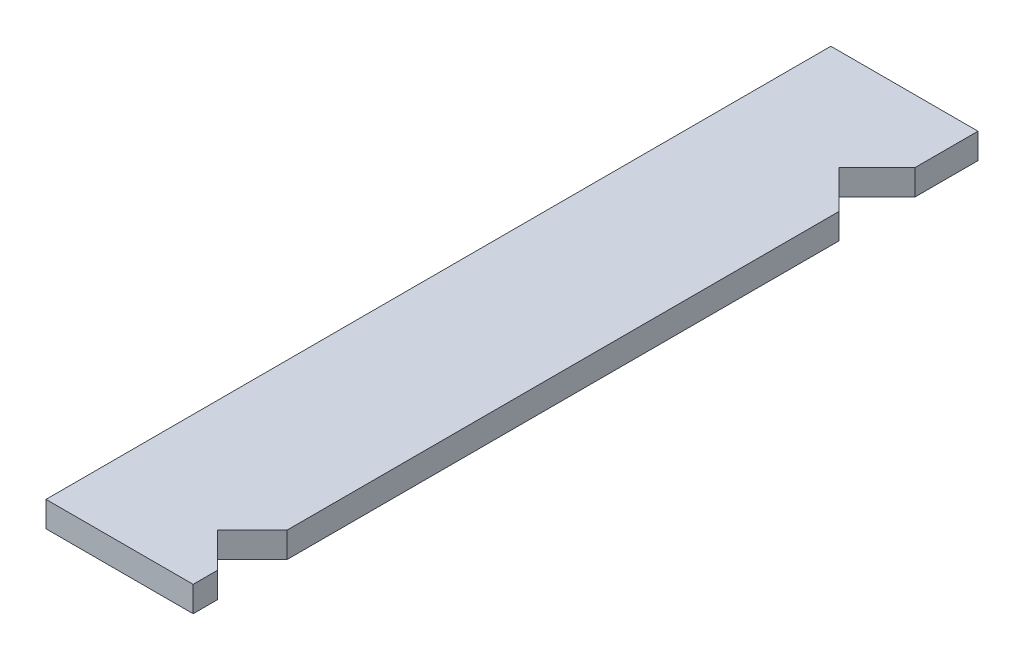
ISO-10303-21;
HEADER;
FILE_DESCRIPTION(('STEP AP214'),'2;1');
FILE_NAME('part.step','',(''),(''),'','','');
FILE_SCHEMA(('AUTOMOTIVE_DESIGN { 1 0 10303 214 1 1 1 1 }'));
ENDSEC;
DATA;
#1=APPLICATION_CONTEXT('core data for automotive mechanical design processes');
#2=APPLICATION_PROTOCOL_DEFINITION('international standard','automotive_design',2000,#1);
#3=PRODUCT_CONTEXT('',#1,'mechanical');
#4=PRODUCT('Part','Part','',(#3));
#5=PRODUCT_RELATED_PRODUCT_CATEGORY('part','',(#4));
#6=PRODUCT_DEFINITION_FORMATION('','',#4);
#7=PRODUCT_DEFINITION_CONTEXT('part definition',#1,'design');
#8=PRODUCT_DEFINITION('design','',#6,#7);
#9=PRODUCT_DEFINITION_SHAPE('','',#8);
#10=(LENGTH_UNIT() NAMED_UNIT(*) SI_UNIT(.MILLI.,.METRE.));
#11=(NAMED_UNIT(*) PLANE_ANGLE_UNIT() SI_UNIT($,.RADIAN.));
#12=(NAMED_UNIT(*) SI_UNIT($,.STERADIAN.) SOLID_ANGLE_UNIT());
#13=UNCERTAINTY_MEASURE_WITH_UNIT(LENGTH_MEASURE(1.E-05),#10,'distance_accuracy_value','');
#14=(GEOMETRIC_REPRESENTATION_CONTEXT(3) GLOBAL_UNCERTAINTY_ASSIGNED_CONTEXT((#13)) GLOBAL_UNIT_ASSIGNED_CONTEXT((#10,
#11,#12)) REPRESENTATION_CONTEXT('',''));
#15=CARTESIAN_POINT('',(0.,0.,0.));
#16=DIRECTION('',(0.,0.,1.));
#17=DIRECTION('',(1.,0.,0.));
#18=AXIS2_PLACEMENT_3D('',#15,#16,#17);
#19=CARTESIAN_POINT('',(30.,5.2,0.));
#20=DIRECTION('',(-1.,0.,0.));
#21=DIRECTION('',(0.,0.,1.));
#22=AXIS2_PLACEMENT_3D('',#19,#20,#21);
#23=PLANE('',#22);
#24=DIRECTION('',(0.,0.,-1.));
#25=VECTOR('',#24,1.);
#26=CARTESIAN_POINT('',(30.,0.,0.));
#27=LINE('',#26,#25);
#28=CARTESIAN_POINT('',(30.,0.,0.));
#29=VERTEX_POINT('',#28);
#30=CARTESIAN_POINT('',(30.,0.,-5.));
#31=VERTEX_POINT('',#30);
#32=EDGE_CURVE('E146',#29,#31,#27,.T.);
#33=ORIENTED_EDGE('',*,*,#32,.T.);
#34=DIRECTION('',(0.,1.,0.));
#35=VECTOR('',#34,1.);
#36=CARTESIAN_POINT('',(30.,-4.8,-5.));
#37=LINE('',#36,#35);
#38=CARTESIAN_POINT('',(30.,5.2,-5.));
#39=VERTEX_POINT('',#38);
#40=EDGE_CURVE('E143',#31,#39,#37,.T.);
#41=ORIENTED_EDGE('',*,*,#40,.T.);
#42=DIRECTION('',(0.,0.,-1.));
#43=VECTOR('',#42,1.);
#44=CARTESIAN_POINT('',(30.,5.2,0.));
#45=LINE('',#44,#43);
#46=CARTESIAN_POINT('',(30.,5.2,0.));
#47=VERTEX_POINT('',#46);
#48=EDGE_CURVE('E129',#47,#39,#45,.T.);
#49=ORIENTED_EDGE('',*,*,#48,.F.);
#50=DIRECTION('',(0.,-1.,0.));
#51=VECTOR('',#50,1.);
#52=CARTESIAN_POINT('',(30.,5.2,0.));
#53=LINE('',#52,#51);
#54=EDGE_CURVE('E158',#47,#29,#53,.T.);
#55=ORIENTED_EDGE('',*,*,#54,.T.);
#56=EDGE_LOOP('',(#33,#41,#49,#55));
#57=FACE_BOUND('',#56,.T.);
#58=ADVANCED_FACE('F33',(#57),#23,.F.);
#59=CARTESIAN_POINT('',(30.,5.2,-19.1421356237311));
#60=VERTEX_POINT('',#59);
#61=CARTESIAN_POINT('',(30.,5.2,-131.642135623731));
#62=VERTEX_POINT('',#61);
#63=EDGE_CURVE('E124',#60,#62,#45,.T.);
#64=ORIENTED_EDGE('',*,*,#63,.F.);
#65=DIRECTION('',(0.,1.,0.));
#66=VECTOR('',#65,1.);
#67=CARTESIAN_POINT('',(30.,-4.8,-19.1421356237311));
#68=LINE('',#67,#66);
#69=CARTESIAN_POINT('',(30.,0.,-19.1421356237311));
#70=VERTEX_POINT('',#69);
#71=EDGE_CURVE('E107',#70,#60,#68,.T.);
#72=ORIENTED_EDGE('',*,*,#71,.F.);
#73=CARTESIAN_POINT('',(30.,0.,-131.642135623731));
#74=VERTEX_POINT('',#73);
#75=EDGE_CURVE('E150',#70,#74,#27,.T.);
#76=ORIENTED_EDGE('',*,*,#75,.T.);
#77=DIRECTION('',(0.,1.,0.));
#78=VECTOR('',#77,1.);
#79=CARTESIAN_POINT('',(30.,-4.8,-131.642135623731));
#80=LINE('',#79,#78);
#81=EDGE_CURVE('E125',#74,#62,#80,.T.);
#82=ORIENTED_EDGE('',*,*,#81,.T.);
#83=EDGE_LOOP('',(#64,#72,#76,#82));
#84=FACE_BOUND('',#83,.T.);
#85=ADVANCED_FACE('F128',(#84),#23,.F.);
#86=CARTESIAN_POINT('',(0.,5.2,0.));
#87=DIRECTION('',(1.,0.,0.));
#88=DIRECTION('',(0.,0.,-1.));
#89=AXIS2_PLACEMENT_3D('',#86,#87,#88);
#90=PLANE('',#89);
#91=DIRECTION('',(0.,0.,1.));
#92=VECTOR('',#91,1.);
#93=CARTESIAN_POINT('',(0.,0.,0.));
#94=LINE('',#93,#92);
#95=CARTESIAN_POINT('',(0.,0.,-160.));
#96=VERTEX_POINT('',#95);
#97=CARTESIAN_POINT('',(0.,0.,0.));
#98=VERTEX_POINT('',#97);
#99=EDGE_CURVE('E139',#96,#98,#94,.T.);
#100=ORIENTED_EDGE('',*,*,#99,.T.);
#101=DIRECTION('',(0.,-1.,0.));
#102=VECTOR('',#101,1.);
#103=CARTESIAN_POINT('',(0.,5.2,0.));
#104=LINE('',#103,#102);
#105=CARTESIAN_POINT('',(0.,5.2,0.));
#106=VERTEX_POINT('',#105);
#107=EDGE_CURVE('E161',#106,#98,#104,.T.);
#108=ORIENTED_EDGE('',*,*,#107,.F.);
#109=DIRECTION('',(0.,0.,1.));
#110=VECTOR('',#109,1.);
#111=CARTESIAN_POINT('',(0.,5.2,0.));
#112=LINE('',#111,#110);
#113=CARTESIAN_POINT('',(0.,5.2,-160.));
#114=VERTEX_POINT('',#113);
#115=EDGE_CURVE('E152',#114,#106,#112,.T.);
#116=ORIENTED_EDGE('',*,*,#115,.F.);
#117=DIRECTION('',(0.,-1.,0.));
#118=VECTOR('',#117,1.);
#119=CARTESIAN_POINT('',(0.,5.2,-160.));
#120=LINE('',#119,#118);
#121=EDGE_CURVE('E138',#114,#96,#120,.T.);
#122=ORIENTED_EDGE('',*,*,#121,.T.);
#123=EDGE_LOOP('',(#100,#108,#116,#122));
#124=FACE_BOUND('',#123,.T.);
#125=ADVANCED_FACE('F35',(#124),#90,.F.);
#126=CARTESIAN_POINT('',(0.,5.2,0.));
#127=DIRECTION('',(0.,0.,-1.));
#128=DIRECTION('',(-1.,0.,0.));
#129=AXIS2_PLACEMENT_3D('',#126,#127,#128);
#130=PLANE('',#129);
#131=DIRECTION('',(1.,0.,0.));
#132=VECTOR('',#131,1.);
#133=CARTESIAN_POINT('',(0.,0.,0.));
#134=LINE('',#133,#132);
#135=EDGE_CURVE('E142',#98,#29,#134,.T.);
#136=ORIENTED_EDGE('',*,*,#135,.T.);
#137=ORIENTED_EDGE('',*,*,#54,.F.);
#138=DIRECTION('',(1.,0.,0.));
#139=VECTOR('',#138,1.);
#140=CARTESIAN_POINT('',(0.,5.2,0.));
#141=LINE('',#140,#139);
#142=EDGE_CURVE('E133',#106,#47,#141,.T.);
#143=ORIENTED_EDGE('',*,*,#142,.F.);
#144=ORIENTED_EDGE('',*,*,#107,.T.);
#145=EDGE_LOOP('',(#136,#137,#143,#144));
#146=FACE_BOUND('',#145,.T.);
#147=ADVANCED_FACE('F196',(#146),#130,.F.);
#148=CARTESIAN_POINT('',(30.,5.2,-147.198484809835));
#149=VERTEX_POINT('',#148);
#150=CARTESIAN_POINT('',(30.,5.2,-160.));
#151=VERTEX_POINT('',#150);
#152=EDGE_CURVE('E130',#149,#151,#45,.T.);
#153=ORIENTED_EDGE('',*,*,#152,.F.);
#154=DIRECTION('',(0.,1.,0.));
#155=VECTOR('',#154,1.);
#156=CARTESIAN_POINT('',(30.,-4.8,-147.198484809835));
#157=LINE('',#156,#155);
#158=CARTESIAN_POINT('',(30.,0.,-147.198484809835));
#159=VERTEX_POINT('',#158);
#160=EDGE_CURVE('E178',#159,#149,#157,.T.);
#161=ORIENTED_EDGE('',*,*,#160,.F.);
#162=CARTESIAN_POINT('',(30.,0.,-160.));
#163=VERTEX_POINT('',#162);
#164=EDGE_CURVE('E145',#159,#163,#27,.T.);
#165=ORIENTED_EDGE('',*,*,#164,.T.);
#166=DIRECTION('',(0.,-1.,0.));
#167=VECTOR('',#166,1.);
#168=CARTESIAN_POINT('',(30.,5.2,-160.));
#169=LINE('',#168,#167);
#170=EDGE_CURVE('E155',#151,#163,#169,.T.);
#171=ORIENTED_EDGE('',*,*,#170,.F.);
#172=EDGE_LOOP('',(#153,#161,#165,#171));
#173=FACE_BOUND('',#172,.T.);
#174=ADVANCED_FACE('F182',(#173),#23,.F.);
#175=CARTESIAN_POINT('',(0.,5.2,-160.));
#176=DIRECTION('',(0.,0.,1.));
#177=DIRECTION('',(1.,0.,0.));
#178=AXIS2_PLACEMENT_3D('',#175,#176,#177);
#179=PLANE('',#178);
#180=DIRECTION('',(-1.,0.,0.));
#181=VECTOR('',#180,1.);
#182=CARTESIAN_POINT('',(0.,0.,-160.));
#183=LINE('',#182,#181);
#184=EDGE_CURVE('E149',#163,#96,#183,.T.);
#185=ORIENTED_EDGE('',*,*,#184,.T.);
#186=ORIENTED_EDGE('',*,*,#121,.F.);
#187=DIRECTION('',(-1.,0.,0.));
#188=VECTOR('',#187,1.);
#189=CARTESIAN_POINT('',(0.,5.2,-160.));
#190=LINE('',#189,#188);
#191=EDGE_CURVE('E132',#151,#114,#190,.T.);
#192=ORIENTED_EDGE('',*,*,#191,.F.);
#193=ORIENTED_EDGE('',*,*,#170,.T.);
#194=EDGE_LOOP('',(#185,#186,#192,#193));
#195=FACE_BOUND('',#194,.T.);
#196=ADVANCED_FACE('F208',(#195),#179,.F.);
#197=CARTESIAN_POINT('',(0.,5.2,0.));
#198=DIRECTION('',(0.,-1.,0.));
#199=DIRECTION('',(0.,0.,-1.));
#200=AXIS2_PLACEMENT_3D('',#197,#198,#199);
#201=PLANE('',#200);
#202=ORIENTED_EDGE('',*,*,#48,.T.);
#203=DIRECTION('',(0.707106781186554,0.,0.707106781186541));
#204=VECTOR('',#203,1.);
#205=CARTESIAN_POINT('',(22.9289321881345,5.2,-12.0710678118654));
#206=LINE('',#205,#204);
#207=CARTESIAN_POINT('',(22.9289321881345,5.2,-12.0710678118654));
#208=VERTEX_POINT('',#207);
#209=EDGE_CURVE('E117',#208,#39,#206,.T.);
#210=ORIENTED_EDGE('',*,*,#209,.F.);
#211=DIRECTION('',(-0.707106781186541,0.,0.707106781186554));
#212=VECTOR('',#211,1.);
#213=CARTESIAN_POINT('',(30.,5.2,-19.1421356237311));
#214=LINE('',#213,#212);
#215=EDGE_CURVE('E110',#60,#208,#214,.T.);
#216=ORIENTED_EDGE('',*,*,#215,.F.);
#217=ORIENTED_EDGE('',*,*,#63,.T.);
#218=DIRECTION('',(0.707106781186552,0.,0.707106781186543));
#219=VECTOR('',#218,1.);
#220=CARTESIAN_POINT('',(30.,5.2,-131.642135623731));
#221=LINE('',#220,#219);
#222=CARTESIAN_POINT('',(22.2218254069479,5.2,-139.420310216783));
#223=VERTEX_POINT('',#222);
#224=EDGE_CURVE('E184',#223,#62,#221,.T.);
#225=ORIENTED_EDGE('',*,*,#224,.F.);
#226=DIRECTION('',(-0.707106781186543,0.,0.707106781186552));
#227=VECTOR('',#226,1.);
#228=CARTESIAN_POINT('',(22.2218254069479,5.2,-139.420310216783));
#229=LINE('',#228,#227);
#230=EDGE_CURVE('E187',#149,#223,#229,.T.);
#231=ORIENTED_EDGE('',*,*,#230,.F.);
#232=ORIENTED_EDGE('',*,*,#152,.T.);
#233=ORIENTED_EDGE('',*,*,#191,.T.);
#234=ORIENTED_EDGE('',*,*,#115,.T.);
#235=ORIENTED_EDGE('',*,*,#142,.T.);
#236=EDGE_LOOP('',(#202,#210,#216,#217,#225,#231,#232,#233,#234,#235));
#237=FACE_BOUND('',#236,.T.);
#238=ADVANCED_FACE('F122',(#237),#201,.F.);
#239=CARTESIAN_POINT('',(0.,0.,0.));
#240=DIRECTION('',(0.,-1.,0.));
#241=DIRECTION('',(0.,0.,-1.));
#242=AXIS2_PLACEMENT_3D('',#239,#240,#241);
#243=PLANE('',#242);
#244=DIRECTION('',(-0.707106781186554,0.,-0.707106781186541));
#245=VECTOR('',#244,1.);
#246=CARTESIAN_POINT('',(17.4999999999997,0.,-17.5));
#247=LINE('',#246,#245);
#248=CARTESIAN_POINT('',(22.9289321881345,0.,-12.0710678118654));
#249=VERTEX_POINT('',#248);
#250=EDGE_CURVE('E11',#31,#249,#247,.T.);
#251=ORIENTED_EDGE('',*,*,#250,.F.);
#252=ORIENTED_EDGE('',*,*,#32,.F.);
#253=ORIENTED_EDGE('',*,*,#135,.F.);
#254=ORIENTED_EDGE('',*,*,#99,.F.);
#255=ORIENTED_EDGE('',*,*,#184,.F.);
#256=ORIENTED_EDGE('',*,*,#164,.F.);
#257=DIRECTION('',(0.707106781186543,0.,-0.707106781186552));
#258=VECTOR('',#257,1.);
#259=CARTESIAN_POINT('',(-58.5992424049174,0.,-58.5992424049168));
#260=LINE('',#259,#258);
#261=CARTESIAN_POINT('',(22.2218254069479,0.,-139.420310216783));
#262=VERTEX_POINT('',#261);
#263=EDGE_CURVE('E164',#262,#159,#260,.T.);
#264=ORIENTED_EDGE('',*,*,#263,.F.);
#265=DIRECTION('',(-0.707106781186552,0.,-0.707106781186543));
#266=VECTOR('',#265,1.);
#267=CARTESIAN_POINT('',(80.8210678118653,0.,-80.8210678118664));
#268=LINE('',#267,#266);
#269=EDGE_CURVE('E166',#74,#262,#268,.T.);
#270=ORIENTED_EDGE('',*,*,#269,.F.);
#271=ORIENTED_EDGE('',*,*,#75,.F.);
#272=DIRECTION('',(0.707106781186541,0.,-0.707106781186554));
#273=VECTOR('',#272,1.);
#274=CARTESIAN_POINT('',(5.42893218813473,0.,5.42893218813464));
#275=LINE('',#274,#273);
#276=EDGE_CURVE('E41',#249,#70,#275,.T.);
#277=ORIENTED_EDGE('',*,*,#276,.F.);
#278=EDGE_LOOP('',(#251,#252,#253,#254,#255,#256,#264,#270,#271,#277));
#279=FACE_BOUND('',#278,.T.);
#280=ADVANCED_FACE('F174',(#279),#243,.T.);
#281=CARTESIAN_POINT('',(30.,-4.8,-131.642135623731));
#282=DIRECTION('',(-0.707106781186543,0.,0.707106781186552));
#283=DIRECTION('',(0.707106781186552,0.,0.707106781186543));
#284=AXIS2_PLACEMENT_3D('',#281,#282,#283);
#285=PLANE('',#284);
#286=ORIENTED_EDGE('',*,*,#269,.T.);
#287=DIRECTION('',(0.,1.,0.));
#288=VECTOR('',#287,1.);
#289=CARTESIAN_POINT('',(22.2218254069479,-4.8,-139.420310216783));
#290=LINE('',#289,#288);
#291=EDGE_CURVE('E55',#262,#223,#290,.T.);
#292=ORIENTED_EDGE('',*,*,#291,.T.);
#293=ORIENTED_EDGE('',*,*,#224,.T.);
#294=ORIENTED_EDGE('',*,*,#81,.F.);
#295=EDGE_LOOP('',(#286,#292,#293,#294));
#296=FACE_BOUND('',#295,.T.);
#297=ADVANCED_FACE('F170',(#296),#285,.F.);
#298=CARTESIAN_POINT('',(22.2218254069479,-4.8,-139.420310216783));
#299=DIRECTION('',(-0.707106781186552,0.,-0.707106781186543));
#300=DIRECTION('',(-0.707106781186543,0.,0.707106781186552));
#301=AXIS2_PLACEMENT_3D('',#298,#299,#300);
#302=PLANE('',#301);
#303=ORIENTED_EDGE('',*,*,#263,.T.);
#304=ORIENTED_EDGE('',*,*,#160,.T.);
#305=ORIENTED_EDGE('',*,*,#230,.T.);
#306=ORIENTED_EDGE('',*,*,#291,.F.);
#307=EDGE_LOOP('',(#303,#304,#305,#306));
#308=FACE_BOUND('',#307,.T.);
#309=ADVANCED_FACE('F177',(#308),#302,.F.);
#310=CARTESIAN_POINT('',(22.9289321881345,-4.8,-12.0710678118654));
#311=DIRECTION('',(-0.707106781186541,0.,0.707106781186554));
#312=DIRECTION('',(0.707106781186554,0.,0.707106781186541));
#313=AXIS2_PLACEMENT_3D('',#310,#311,#312);
#314=PLANE('',#313);
#315=ORIENTED_EDGE('',*,*,#250,.T.);
#316=DIRECTION('',(0.,1.,0.));
#317=VECTOR('',#316,1.);
#318=CARTESIAN_POINT('',(22.9289321881345,-4.8,-12.0710678118654));
#319=LINE('',#318,#317);
#320=EDGE_CURVE('E48',#249,#208,#319,.T.);
#321=ORIENTED_EDGE('',*,*,#320,.T.);
#322=ORIENTED_EDGE('',*,*,#209,.T.);
#323=ORIENTED_EDGE('',*,*,#40,.F.);
#324=EDGE_LOOP('',(#315,#321,#322,#323));
#325=FACE_BOUND('',#324,.T.);
#326=ADVANCED_FACE('F211',(#325),#314,.F.);
#327=CARTESIAN_POINT('',(30.,-4.8,-19.1421356237311));
#328=DIRECTION('',(-0.707106781186554,0.,-0.707106781186541));
#329=DIRECTION('',(-0.707106781186541,0.,0.707106781186554));
#330=AXIS2_PLACEMENT_3D('',#327,#328,#329);
#331=PLANE('',#330);
#332=ORIENTED_EDGE('',*,*,#276,.T.);
#333=ORIENTED_EDGE('',*,*,#71,.T.);
#334=ORIENTED_EDGE('',*,*,#215,.T.);
#335=ORIENTED_EDGE('',*,*,#320,.F.);
#336=EDGE_LOOP('',(#332,#333,#334,#335));
#337=FACE_BOUND('',#336,.T.);
#338=ADVANCED_FACE('F109',(#337),#331,.F.);
#339=CLOSED_SHELL('',(#58,#85,#125,#147,#174,#196,#238,#280,#297,#309,#326,#338));
#340=MANIFOLD_SOLID_BREP('B2',#339);
#341=ADVANCED_BREP_SHAPE_REPRESENTATION('',(#18,#340),#14);
#342=SHAPE_DEFINITION_REPRESENTATION(#9,#341);
ENDSEC;
END-ISO-10303-21;
